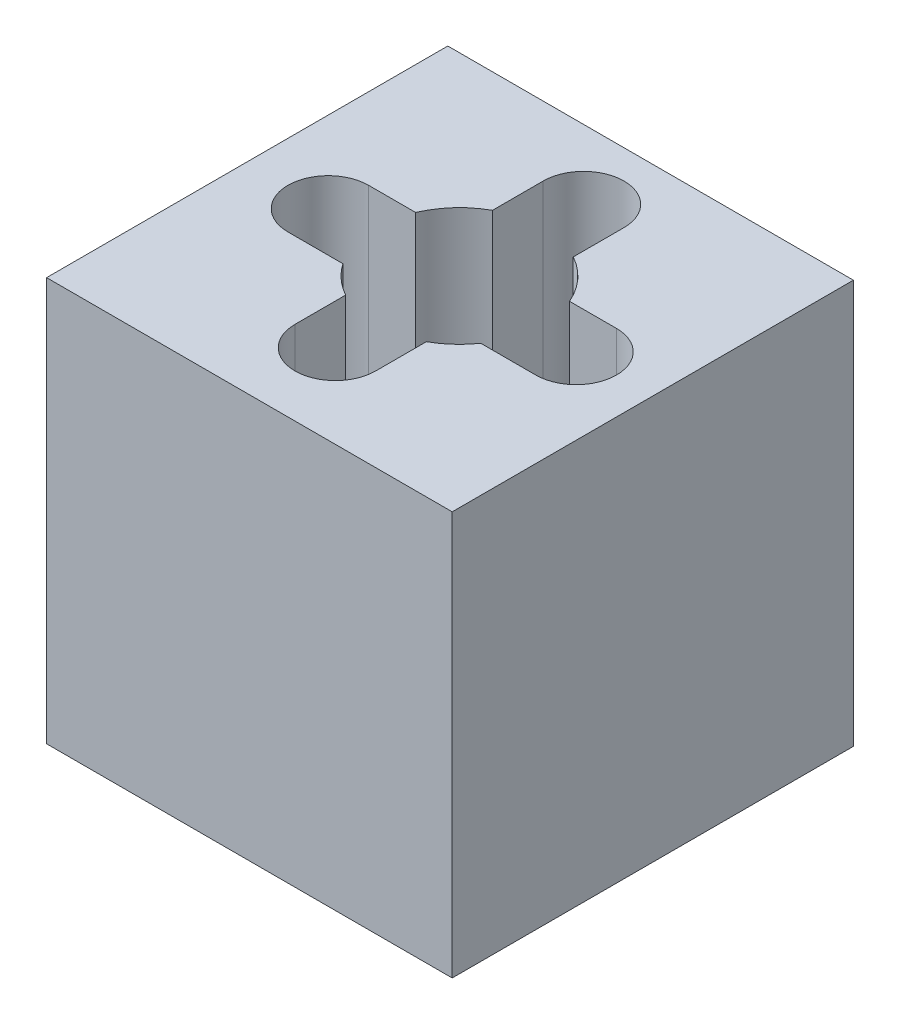
ISO-10303-21;
HEADER;
FILE_DESCRIPTION(('STEP AP214'),'2;1');
FILE_NAME('part.step','',(''),(''),'','','');
FILE_SCHEMA(('AUTOMOTIVE_DESIGN { 1 0 10303 214 1 1 1 1 }'));
ENDSEC;
DATA;
#1=APPLICATION_CONTEXT('core data for automotive mechanical design processes');
#2=APPLICATION_PROTOCOL_DEFINITION('international standard','automotive_design',2000,#1);
#3=PRODUCT_CONTEXT('',#1,'mechanical');
#4=PRODUCT('Part','Part','',(#3));
#5=PRODUCT_RELATED_PRODUCT_CATEGORY('part','',(#4));
#6=PRODUCT_DEFINITION_FORMATION('','',#4);
#7=PRODUCT_DEFINITION_CONTEXT('part definition',#1,'design');
#8=PRODUCT_DEFINITION('design','',#6,#7);
#9=PRODUCT_DEFINITION_SHAPE('','',#8);
#10=(LENGTH_UNIT() NAMED_UNIT(*) SI_UNIT(.MILLI.,.METRE.));
#11=(NAMED_UNIT(*) PLANE_ANGLE_UNIT() SI_UNIT($,.RADIAN.));
#12=(NAMED_UNIT(*) SI_UNIT($,.STERADIAN.) SOLID_ANGLE_UNIT());
#13=UNCERTAINTY_MEASURE_WITH_UNIT(LENGTH_MEASURE(1.E-05),#10,'distance_accuracy_value','');
#14=(GEOMETRIC_REPRESENTATION_CONTEXT(3) GLOBAL_UNCERTAINTY_ASSIGNED_CONTEXT((#13)) GLOBAL_UNIT_ASSIGNED_CONTEXT((#10,
#11,#12)) REPRESENTATION_CONTEXT('',''));
#15=CARTESIAN_POINT('',(0.,0.,0.));
#16=DIRECTION('',(0.,0.,1.));
#17=DIRECTION('',(1.,0.,0.));
#18=AXIS2_PLACEMENT_3D('',#15,#16,#17);
#19=CARTESIAN_POINT('',(2.52404638109781,5.08,0.));
#20=DIRECTION('',(1.,0.,0.));
#21=DIRECTION('',(0.,0.,-1.));
#22=AXIS2_PLACEMENT_3D('',#19,#20,#21);
#23=PLANE('',#22);
#24=DIRECTION('',(0.,0.,1.));
#25=VECTOR('',#24,1.);
#26=CARTESIAN_POINT('',(2.52404638109781,0.,0.));
#27=LINE('',#26,#25);
#28=CARTESIAN_POINT('',(2.52404638109781,0.,-2.43268730964854));
#29=VERTEX_POINT('',#28);
#30=CARTESIAN_POINT('',(2.52404638109781,0.,2.61535789353507));
#31=VERTEX_POINT('',#30);
#32=EDGE_CURVE('E326',#29,#31,#27,.T.);
#33=ORIENTED_EDGE('',*,*,#32,.F.);
#34=DIRECTION('',(0.,-1.,0.));
#35=VECTOR('',#34,1.);
#36=CARTESIAN_POINT('',(2.52404638109781,5.08,-2.43268730964854));
#37=LINE('',#36,#35);
#38=CARTESIAN_POINT('',(2.52404638109781,5.08,-2.43268730964854));
#39=VERTEX_POINT('',#38);
#40=EDGE_CURVE('E12',#39,#29,#37,.T.);
#41=ORIENTED_EDGE('',*,*,#40,.F.);
#42=DIRECTION('',(0.,0.,1.));
#43=VECTOR('',#42,1.);
#44=CARTESIAN_POINT('',(2.52404638109781,5.08,0.));
#45=LINE('',#44,#43);
#46=CARTESIAN_POINT('',(2.52404638109781,5.08,2.61535789353507));
#47=VERTEX_POINT('',#46);
#48=EDGE_CURVE('E354',#39,#47,#45,.T.);
#49=ORIENTED_EDGE('',*,*,#48,.T.);
#50=DIRECTION('',(0.,-1.,0.));
#51=VECTOR('',#50,1.);
#52=CARTESIAN_POINT('',(2.52404638109781,5.08,2.61535789353507));
#53=LINE('',#52,#51);
#54=EDGE_CURVE('E366',#47,#31,#53,.T.);
#55=ORIENTED_EDGE('',*,*,#54,.T.);
#56=EDGE_LOOP('',(#33,#41,#49,#55));
#57=FACE_BOUND('',#56,.T.);
#58=ADVANCED_FACE('F95',(#57),#23,.T.);
#59=CARTESIAN_POINT('',(0.,5.08,-2.43268730964854));
#60=DIRECTION('',(0.,0.,-1.));
#61=DIRECTION('',(-1.,0.,0.));
#62=AXIS2_PLACEMENT_3D('',#59,#60,#61);
#63=PLANE('',#62);
#64=DIRECTION('',(1.,0.,0.));
#65=VECTOR('',#64,1.);
#66=CARTESIAN_POINT('',(0.,0.,-2.43268730964854));
#67=LINE('',#66,#65);
#68=CARTESIAN_POINT('',(-2.57945038398401,0.,-2.43268730964854));
#69=VERTEX_POINT('',#68);
#70=EDGE_CURVE('E369',#69,#29,#67,.T.);
#71=ORIENTED_EDGE('',*,*,#70,.F.);
#72=DIRECTION('',(0.,-1.,0.));
#73=VECTOR('',#72,1.);
#74=CARTESIAN_POINT('',(-2.57945038398401,5.08,-2.43268730964854));
#75=LINE('',#74,#73);
#76=CARTESIAN_POINT('',(-2.57945038398401,5.08,-2.43268730964854));
#77=VERTEX_POINT('',#76);
#78=EDGE_CURVE('E102',#77,#69,#75,.T.);
#79=ORIENTED_EDGE('',*,*,#78,.F.);
#80=DIRECTION('',(1.,0.,0.));
#81=VECTOR('',#80,1.);
#82=CARTESIAN_POINT('',(0.,5.08,-2.43268730964854));
#83=LINE('',#82,#81);
#84=EDGE_CURVE('E357',#77,#39,#83,.T.);
#85=ORIENTED_EDGE('',*,*,#84,.T.);
#86=ORIENTED_EDGE('',*,*,#40,.T.);
#87=EDGE_LOOP('',(#71,#79,#85,#86));
#88=FACE_BOUND('',#87,.T.);
#89=ADVANCED_FACE('F386',(#88),#63,.T.);
#90=CARTESIAN_POINT('',(-2.57945038398401,5.08,0.));
#91=DIRECTION('',(-1.,0.,0.));
#92=DIRECTION('',(0.,0.,1.));
#93=AXIS2_PLACEMENT_3D('',#90,#91,#92);
#94=PLANE('',#93);
#95=DIRECTION('',(0.,0.,-1.));
#96=VECTOR('',#95,1.);
#97=CARTESIAN_POINT('',(-2.57945038398401,0.,0.));
#98=LINE('',#97,#96);
#99=CARTESIAN_POINT('',(-2.57945038398401,0.,2.61535789353507));
#100=VERTEX_POINT('',#99);
#101=EDGE_CURVE('E372',#100,#69,#98,.T.);
#102=ORIENTED_EDGE('',*,*,#101,.F.);
#103=DIRECTION('',(0.,-1.,0.));
#104=VECTOR('',#103,1.);
#105=CARTESIAN_POINT('',(-2.57945038398401,5.08,2.61535789353507));
#106=LINE('',#105,#104);
#107=CARTESIAN_POINT('',(-2.57945038398401,5.08,2.61535789353507));
#108=VERTEX_POINT('',#107);
#109=EDGE_CURVE('E378',#108,#100,#106,.T.);
#110=ORIENTED_EDGE('',*,*,#109,.F.);
#111=DIRECTION('',(0.,0.,-1.));
#112=VECTOR('',#111,1.);
#113=CARTESIAN_POINT('',(-2.57945038398401,5.08,0.));
#114=LINE('',#113,#112);
#115=EDGE_CURVE('E361',#108,#77,#114,.T.);
#116=ORIENTED_EDGE('',*,*,#115,.T.);
#117=ORIENTED_EDGE('',*,*,#78,.T.);
#118=EDGE_LOOP('',(#102,#110,#116,#117));
#119=FACE_BOUND('',#118,.T.);
#120=ADVANCED_FACE('F382',(#119),#94,.T.);
#121=CARTESIAN_POINT('',(0.,5.08,2.61535789353507));
#122=DIRECTION('',(0.,0.,-1.));
#123=DIRECTION('',(-1.,0.,0.));
#124=AXIS2_PLACEMENT_3D('',#121,#122,#123);
#125=PLANE('',#124);
#126=DIRECTION('',(1.,0.,0.));
#127=VECTOR('',#126,1.);
#128=CARTESIAN_POINT('',(0.,0.,2.61535789353507));
#129=LINE('',#128,#127);
#130=EDGE_CURVE('E358',#100,#31,#129,.T.);
#131=ORIENTED_EDGE('',*,*,#130,.T.);
#132=ORIENTED_EDGE('',*,*,#54,.F.);
#133=DIRECTION('',(1.,0.,0.));
#134=VECTOR('',#133,1.);
#135=CARTESIAN_POINT('',(0.,5.08,2.61535789353507));
#136=LINE('',#135,#134);
#137=EDGE_CURVE('E364',#108,#47,#136,.T.);
#138=ORIENTED_EDGE('',*,*,#137,.F.);
#139=ORIENTED_EDGE('',*,*,#109,.T.);
#140=EDGE_LOOP('',(#131,#132,#138,#139));
#141=FACE_BOUND('',#140,.T.);
#142=ADVANCED_FACE('F393',(#141),#125,.F.);
#143=CARTESIAN_POINT('',(0.,5.08,0.));
#144=DIRECTION('',(0.,1.,0.));
#145=DIRECTION('',(0.,0.,1.));
#146=AXIS2_PLACEMENT_3D('',#143,#144,#145);
#147=PLANE('',#146);
#148=CARTESIAN_POINT('',(-1.55942754703309,5.08,0.0913352919432654));
#149=DIRECTION('',(0.,-1.,0.));
#150=DIRECTION('',(0.,0.,-1.));
#151=AXIS2_PLACEMENT_3D('',#148,#149,#150);
#152=CIRCLE('',#151,0.508);
#153=CARTESIAN_POINT('',(-1.55942754703309,5.08,0.599335291943265));
#154=VERTEX_POINT('',#153);
#155=CARTESIAN_POINT('',(-1.55942754703309,5.08,-0.416664708056734));
#156=VERTEX_POINT('',#155);
#157=EDGE_CURVE('E232',#154,#156,#152,.T.);
#158=ORIENTED_EDGE('',*,*,#157,.T.);
#159=DIRECTION('',(1.,0.,0.));
#160=VECTOR('',#159,1.);
#161=CARTESIAN_POINT('',(-1.55942754703309,5.08,-0.416664708056734));
#162=LINE('',#161,#160);
#163=CARTESIAN_POINT('',(-0.968254786231391,5.08,-0.416664708056734));
#164=VERTEX_POINT('',#163);
#165=EDGE_CURVE('E238',#156,#164,#162,.T.);
#166=ORIENTED_EDGE('',*,*,#165,.T.);
#167=CARTESIAN_POINT('',(0.,5.08,0.));
#168=DIRECTION('',(0.,1.,0.));
#169=DIRECTION('',(0.,0.,1.));
#170=AXIS2_PLACEMENT_3D('',#167,#168,#169);
#171=CIRCLE('',#170,1.0541);
#172=CARTESIAN_POINT('',(-0.508,5.08,-0.923613994047297));
#173=VERTEX_POINT('',#172);
#174=EDGE_CURVE('E242',#173,#164,#171,.T.);
#175=ORIENTED_EDGE('',*,*,#174,.F.);
#176=DIRECTION('',(0.,0.,1.));
#177=VECTOR('',#176,1.);
#178=CARTESIAN_POINT('',(-0.508,5.08,-1.5621));
#179=LINE('',#178,#177);
#180=CARTESIAN_POINT('',(-0.508,5.08,-1.5621));
#181=VERTEX_POINT('',#180);
#182=EDGE_CURVE('E254',#181,#173,#179,.T.);
#183=ORIENTED_EDGE('',*,*,#182,.F.);
#184=CARTESIAN_POINT('',(0.,5.08,-1.5621));
#185=DIRECTION('',(0.,1.,0.));
#186=DIRECTION('',(0.,0.,1.));
#187=AXIS2_PLACEMENT_3D('',#184,#185,#186);
#188=CIRCLE('',#187,0.508);
#189=CARTESIAN_POINT('',(0.508,5.08,-1.5621));
#190=VERTEX_POINT('',#189);
#191=EDGE_CURVE('E256',#190,#181,#188,.T.);
#192=ORIENTED_EDGE('',*,*,#191,.F.);
#193=DIRECTION('',(0.,0.,1.));
#194=VECTOR('',#193,1.);
#195=CARTESIAN_POINT('',(0.508,5.08,-1.5621));
#196=LINE('',#195,#194);
#197=CARTESIAN_POINT('',(0.508,5.08,-0.923613994047297));
#198=VERTEX_POINT('',#197);
#199=EDGE_CURVE('E258',#190,#198,#196,.T.);
#200=ORIENTED_EDGE('',*,*,#199,.T.);
#201=CARTESIAN_POINT('',(0.,5.08,0.));
#202=DIRECTION('',(0.,1.,0.));
#203=DIRECTION('',(0.,0.,1.));
#204=AXIS2_PLACEMENT_3D('',#201,#202,#203);
#205=CIRCLE('',#204,1.0541);
#206=CARTESIAN_POINT('',(0.968254786231391,5.08,-0.416664708056734));
#207=VERTEX_POINT('',#206);
#208=EDGE_CURVE('E261',#207,#198,#205,.T.);
#209=ORIENTED_EDGE('',*,*,#208,.F.);
#210=DIRECTION('',(-1.,0.,0.));
#211=VECTOR('',#210,1.);
#212=CARTESIAN_POINT('',(1.55942754703309,5.08,-0.416664708056735));
#213=LINE('',#212,#211);
#214=CARTESIAN_POINT('',(1.55942754703309,5.08,-0.416664708056735));
#215=VERTEX_POINT('',#214);
#216=EDGE_CURVE('E263',#215,#207,#213,.T.);
#217=ORIENTED_EDGE('',*,*,#216,.F.);
#218=CARTESIAN_POINT('',(1.55942754703309,5.08,0.091335291943265));
#219=DIRECTION('',(0.,1.,0.));
#220=DIRECTION('',(0.,0.,1.));
#221=AXIS2_PLACEMENT_3D('',#218,#219,#220);
#222=CIRCLE('',#221,0.508);
#223=CARTESIAN_POINT('',(1.55942754703309,5.08,0.599335291943265));
#224=VERTEX_POINT('',#223);
#225=EDGE_CURVE('E265',#224,#215,#222,.T.);
#226=ORIENTED_EDGE('',*,*,#225,.F.);
#227=DIRECTION('',(-1.,0.,0.));
#228=VECTOR('',#227,1.);
#229=CARTESIAN_POINT('',(1.55942754703309,5.08,0.599335291943265));
#230=LINE('',#229,#228);
#231=CARTESIAN_POINT('',(0.86713552448927,5.08,0.599335291943265));
#232=VERTEX_POINT('',#231);
#233=EDGE_CURVE('E267',#224,#232,#230,.T.);
#234=ORIENTED_EDGE('',*,*,#233,.T.);
#235=CARTESIAN_POINT('',(0.,5.08,0.));
#236=DIRECTION('',(0.,1.,0.));
#237=DIRECTION('',(0.,0.,1.));
#238=AXIS2_PLACEMENT_3D('',#235,#236,#237);
#239=CIRCLE('',#238,1.0541);
#240=CARTESIAN_POINT('',(0.508,5.08,0.923613994047297));
#241=VERTEX_POINT('',#240);
#242=EDGE_CURVE('E270',#241,#232,#239,.T.);
#243=ORIENTED_EDGE('',*,*,#242,.F.);
#244=DIRECTION('',(0.,0.,-1.));
#245=VECTOR('',#244,1.);
#246=CARTESIAN_POINT('',(0.508,5.08,1.5621));
#247=LINE('',#246,#245);
#248=CARTESIAN_POINT('',(0.508,5.08,1.5621));
#249=VERTEX_POINT('',#248);
#250=EDGE_CURVE('E272',#249,#241,#247,.T.);
#251=ORIENTED_EDGE('',*,*,#250,.F.);
#252=CARTESIAN_POINT('',(0.,5.08,1.5621));
#253=DIRECTION('',(0.,-1.,0.));
#254=DIRECTION('',(0.,0.,-1.));
#255=AXIS2_PLACEMENT_3D('',#252,#253,#254);
#256=CIRCLE('',#255,0.508);
#257=CARTESIAN_POINT('',(-0.508,5.08,1.5621));
#258=VERTEX_POINT('',#257);
#259=EDGE_CURVE('E274',#249,#258,#256,.T.);
#260=ORIENTED_EDGE('',*,*,#259,.T.);
#261=DIRECTION('',(0.,0.,-1.));
#262=VECTOR('',#261,1.);
#263=CARTESIAN_POINT('',(-0.508,5.08,1.5621));
#264=LINE('',#263,#262);
#265=CARTESIAN_POINT('',(-0.508,5.08,0.923613994047297));
#266=VERTEX_POINT('',#265);
#267=EDGE_CURVE('E277',#258,#266,#264,.T.);
#268=ORIENTED_EDGE('',*,*,#267,.T.);
#269=CARTESIAN_POINT('',(0.,5.08,0.));
#270=DIRECTION('',(0.,1.,0.));
#271=DIRECTION('',(0.,0.,1.));
#272=AXIS2_PLACEMENT_3D('',#269,#270,#271);
#273=CIRCLE('',#272,1.0541);
#274=CARTESIAN_POINT('',(-0.86713552448927,5.08,0.599335291943265));
#275=VERTEX_POINT('',#274);
#276=EDGE_CURVE('E280',#275,#266,#273,.T.);
#277=ORIENTED_EDGE('',*,*,#276,.F.);
#278=DIRECTION('',(1.,0.,0.));
#279=VECTOR('',#278,1.);
#280=CARTESIAN_POINT('',(-1.55942754703309,5.08,0.599335291943265));
#281=LINE('',#280,#279);
#282=EDGE_CURVE('E235',#154,#275,#281,.T.);
#283=ORIENTED_EDGE('',*,*,#282,.F.);
#284=EDGE_LOOP('',(#158,#166,#175,#183,#192,#200,#209,#217,#226,#234,#243,#251,#260,#268,#277,#283));
#285=FACE_BOUND('',#284,.T.);
#286=ORIENTED_EDGE('',*,*,#48,.F.);
#287=ORIENTED_EDGE('',*,*,#84,.F.);
#288=ORIENTED_EDGE('',*,*,#115,.F.);
#289=ORIENTED_EDGE('',*,*,#137,.T.);
#290=EDGE_LOOP('',(#286,#287,#288,#289));
#291=FACE_BOUND('',#290,.T.);
#292=ADVANCED_FACE('F244',(#285,#291),#147,.T.);
#293=CARTESIAN_POINT('',(0.,0.,0.));
#294=DIRECTION('',(0.,1.,0.));
#295=DIRECTION('',(0.,0.,1.));
#296=AXIS2_PLACEMENT_3D('',#293,#294,#295);
#297=PLANE('',#296);
#298=DIRECTION('',(1.,0.,0.));
#299=VECTOR('',#298,1.);
#300=CARTESIAN_POINT('',(-1.55942754703309,0.,-0.416664708056734));
#301=LINE('',#300,#299);
#302=CARTESIAN_POINT('',(-1.55942754703309,0.,-0.416664708056734));
#303=VERTEX_POINT('',#302);
#304=CARTESIAN_POINT('',(-0.968254786231391,0.,-0.416664708056735));
#305=VERTEX_POINT('',#304);
#306=EDGE_CURVE('E284',#303,#305,#301,.T.);
#307=ORIENTED_EDGE('',*,*,#306,.F.);
#308=CARTESIAN_POINT('',(-1.55942754703309,0.,0.0913352919432654));
#309=DIRECTION('',(0.,-1.,0.));
#310=DIRECTION('',(0.,0.,-1.));
#311=AXIS2_PLACEMENT_3D('',#308,#309,#310);
#312=CIRCLE('',#311,0.508);
#313=CARTESIAN_POINT('',(-1.55942754703309,0.,0.599335291943265));
#314=VERTEX_POINT('',#313);
#315=EDGE_CURVE('E117',#314,#303,#312,.T.);
#316=ORIENTED_EDGE('',*,*,#315,.F.);
#317=DIRECTION('',(1.,0.,0.));
#318=VECTOR('',#317,1.);
#319=CARTESIAN_POINT('',(-1.55942754703309,0.,0.599335291943265));
#320=LINE('',#319,#318);
#321=CARTESIAN_POINT('',(-0.86713552448927,0.,0.599335291943265));
#322=VERTEX_POINT('',#321);
#323=EDGE_CURVE('E247',#314,#322,#320,.T.);
#324=ORIENTED_EDGE('',*,*,#323,.T.);
#325=CARTESIAN_POINT('',(0.,0.,0.));
#326=DIRECTION('',(0.,1.,0.));
#327=DIRECTION('',(0.,0.,1.));
#328=AXIS2_PLACEMENT_3D('',#325,#326,#327);
#329=CIRCLE('',#328,1.0541);
#330=CARTESIAN_POINT('',(-0.508,0.,0.923613994047297));
#331=VERTEX_POINT('',#330);
#332=EDGE_CURVE('E250',#322,#331,#329,.T.);
#333=ORIENTED_EDGE('',*,*,#332,.T.);
#334=DIRECTION('',(0.,0.,-1.));
#335=VECTOR('',#334,1.);
#336=CARTESIAN_POINT('',(-0.508,0.,1.5621));
#337=LINE('',#336,#335);
#338=CARTESIAN_POINT('',(-0.508,0.,1.5621));
#339=VERTEX_POINT('',#338);
#340=EDGE_CURVE('E319',#339,#331,#337,.T.);
#341=ORIENTED_EDGE('',*,*,#340,.F.);
#342=CARTESIAN_POINT('',(0.,0.,1.5621));
#343=DIRECTION('',(0.,-1.,0.));
#344=DIRECTION('',(0.,0.,-1.));
#345=AXIS2_PLACEMENT_3D('',#342,#343,#344);
#346=CIRCLE('',#345,0.508);
#347=CARTESIAN_POINT('',(0.508,0.,1.5621));
#348=VERTEX_POINT('',#347);
#349=EDGE_CURVE('E316',#348,#339,#346,.T.);
#350=ORIENTED_EDGE('',*,*,#349,.F.);
#351=DIRECTION('',(0.,0.,-1.));
#352=VECTOR('',#351,1.);
#353=CARTESIAN_POINT('',(0.508,0.,1.5621));
#354=LINE('',#353,#352);
#355=CARTESIAN_POINT('',(0.508,0.,0.923613994047297));
#356=VERTEX_POINT('',#355);
#357=EDGE_CURVE('E313',#348,#356,#354,.T.);
#358=ORIENTED_EDGE('',*,*,#357,.T.);
#359=CARTESIAN_POINT('',(0.,0.,0.));
#360=DIRECTION('',(0.,1.,0.));
#361=DIRECTION('',(0.,0.,1.));
#362=AXIS2_PLACEMENT_3D('',#359,#360,#361);
#363=CIRCLE('',#362,1.0541);
#364=CARTESIAN_POINT('',(0.86713552448927,0.,0.599335291943265));
#365=VERTEX_POINT('',#364);
#366=EDGE_CURVE('E310',#356,#365,#363,.T.);
#367=ORIENTED_EDGE('',*,*,#366,.T.);
#368=DIRECTION('',(-1.,0.,0.));
#369=VECTOR('',#368,1.);
#370=CARTESIAN_POINT('',(1.55942754703309,0.,0.599335291943265));
#371=LINE('',#370,#369);
#372=CARTESIAN_POINT('',(1.55942754703309,0.,0.599335291943265));
#373=VERTEX_POINT('',#372);
#374=EDGE_CURVE('E307',#373,#365,#371,.T.);
#375=ORIENTED_EDGE('',*,*,#374,.F.);
#376=CARTESIAN_POINT('',(1.55942754703309,0.,0.091335291943265));
#377=DIRECTION('',(0.,1.,0.));
#378=DIRECTION('',(0.,0.,1.));
#379=AXIS2_PLACEMENT_3D('',#376,#377,#378);
#380=CIRCLE('',#379,0.508);
#381=CARTESIAN_POINT('',(1.55942754703309,0.,-0.416664708056735));
#382=VERTEX_POINT('',#381);
#383=EDGE_CURVE('E304',#373,#382,#380,.T.);
#384=ORIENTED_EDGE('',*,*,#383,.T.);
#385=DIRECTION('',(-1.,0.,0.));
#386=VECTOR('',#385,1.);
#387=CARTESIAN_POINT('',(1.55942754703309,0.,-0.416664708056735));
#388=LINE('',#387,#386);
#389=CARTESIAN_POINT('',(0.968254786231391,0.,-0.416664708056734));
#390=VERTEX_POINT('',#389);
#391=EDGE_CURVE('E301',#382,#390,#388,.T.);
#392=ORIENTED_EDGE('',*,*,#391,.T.);
#393=CARTESIAN_POINT('',(0.,0.,0.));
#394=DIRECTION('',(0.,1.,0.));
#395=DIRECTION('',(0.,0.,1.));
#396=AXIS2_PLACEMENT_3D('',#393,#394,#395);
#397=CIRCLE('',#396,1.0541);
#398=CARTESIAN_POINT('',(0.508,0.,-0.923613994047297));
#399=VERTEX_POINT('',#398);
#400=EDGE_CURVE('E298',#390,#399,#397,.T.);
#401=ORIENTED_EDGE('',*,*,#400,.T.);
#402=DIRECTION('',(0.,0.,1.));
#403=VECTOR('',#402,1.);
#404=CARTESIAN_POINT('',(0.508,0.,-1.5621));
#405=LINE('',#404,#403);
#406=CARTESIAN_POINT('',(0.508,0.,-1.5621));
#407=VERTEX_POINT('',#406);
#408=EDGE_CURVE('E295',#407,#399,#405,.T.);
#409=ORIENTED_EDGE('',*,*,#408,.F.);
#410=CARTESIAN_POINT('',(0.,0.,-1.5621));
#411=DIRECTION('',(0.,1.,0.));
#412=DIRECTION('',(0.,0.,1.));
#413=AXIS2_PLACEMENT_3D('',#410,#411,#412);
#414=CIRCLE('',#413,0.508);
#415=CARTESIAN_POINT('',(-0.508,0.,-1.5621));
#416=VERTEX_POINT('',#415);
#417=EDGE_CURVE('E292',#407,#416,#414,.T.);
#418=ORIENTED_EDGE('',*,*,#417,.T.);
#419=DIRECTION('',(0.,0.,1.));
#420=VECTOR('',#419,1.);
#421=CARTESIAN_POINT('',(-0.508,0.,-1.5621));
#422=LINE('',#421,#420);
#423=CARTESIAN_POINT('',(-0.508,0.,-0.923613994047297));
#424=VERTEX_POINT('',#423);
#425=EDGE_CURVE('E289',#416,#424,#422,.T.);
#426=ORIENTED_EDGE('',*,*,#425,.T.);
#427=CARTESIAN_POINT('',(0.,0.,0.));
#428=DIRECTION('',(0.,1.,0.));
#429=DIRECTION('',(0.,0.,1.));
#430=AXIS2_PLACEMENT_3D('',#427,#428,#429);
#431=CIRCLE('',#430,1.0541);
#432=EDGE_CURVE('E286',#424,#305,#431,.T.);
#433=ORIENTED_EDGE('',*,*,#432,.T.);
#434=EDGE_LOOP('',(#307,#316,#324,#333,#341,#350,#358,#367,#375,#384,#392,#401,#409,#418,#426,#433));
#435=FACE_BOUND('',#434,.T.);
#436=ORIENTED_EDGE('',*,*,#32,.T.);
#437=ORIENTED_EDGE('',*,*,#130,.F.);
#438=ORIENTED_EDGE('',*,*,#101,.T.);
#439=ORIENTED_EDGE('',*,*,#70,.T.);
#440=EDGE_LOOP('',(#436,#437,#438,#439));
#441=FACE_BOUND('',#440,.T.);
#442=ADVANCED_FACE('F390',(#435,#441),#297,.F.);
#443=CARTESIAN_POINT('',(-1.55942754703309,5.08,0.0913352919432654));
#444=DIRECTION('',(0.,-1.,0.));
#445=DIRECTION('',(0.,0.,-1.));
#446=AXIS2_PLACEMENT_3D('',#443,#444,#445);
#447=CYLINDRICAL_SURFACE('',#446,0.508);
#448=ORIENTED_EDGE('',*,*,#315,.T.);
#449=DIRECTION('',(0.,-1.,0.));
#450=VECTOR('',#449,1.);
#451=CARTESIAN_POINT('',(-1.55942754703309,5.08,-0.416664708056734));
#452=LINE('',#451,#450);
#453=EDGE_CURVE('E229',#156,#303,#452,.T.);
#454=ORIENTED_EDGE('',*,*,#453,.F.);
#455=ORIENTED_EDGE('',*,*,#157,.F.);
#456=DIRECTION('',(0.,-1.,0.));
#457=VECTOR('',#456,1.);
#458=CARTESIAN_POINT('',(-1.55942754703309,5.08,0.599335291943265));
#459=LINE('',#458,#457);
#460=EDGE_CURVE('E324',#154,#314,#459,.T.);
#461=ORIENTED_EDGE('',*,*,#460,.T.);
#462=EDGE_LOOP('',(#448,#454,#455,#461));
#463=FACE_BOUND('',#462,.T.);
#464=ADVANCED_FACE('F230',(#463),#447,.F.);
#465=CARTESIAN_POINT('',(-1.55942754703309,5.08,0.599335291943265));
#466=DIRECTION('',(0.,0.,-1.));
#467=DIRECTION('',(-1.,0.,0.));
#468=AXIS2_PLACEMENT_3D('',#465,#466,#467);
#469=PLANE('',#468);
#470=ORIENTED_EDGE('',*,*,#323,.F.);
#471=ORIENTED_EDGE('',*,*,#460,.F.);
#472=ORIENTED_EDGE('',*,*,#282,.T.);
#473=DIRECTION('',(0.,-1.,0.));
#474=VECTOR('',#473,1.);
#475=CARTESIAN_POINT('',(-0.86713552448927,5.08,0.599335291943265));
#476=LINE('',#475,#474);
#477=EDGE_CURVE('E327',#275,#322,#476,.T.);
#478=ORIENTED_EDGE('',*,*,#477,.T.);
#479=EDGE_LOOP('',(#470,#471,#472,#478));
#480=FACE_BOUND('',#479,.T.);
#481=ADVANCED_FACE('F415',(#480),#469,.T.);
#482=CARTESIAN_POINT('',(0.,5.08,0.));
#483=DIRECTION('',(0.,-1.,0.));
#484=DIRECTION('',(0.,0.,-1.));
#485=AXIS2_PLACEMENT_3D('',#482,#483,#484);
#486=CYLINDRICAL_SURFACE('',#485,1.0541);
#487=ORIENTED_EDGE('',*,*,#332,.F.);
#488=ORIENTED_EDGE('',*,*,#477,.F.);
#489=ORIENTED_EDGE('',*,*,#276,.T.);
#490=DIRECTION('',(0.,-1.,0.));
#491=VECTOR('',#490,1.);
#492=CARTESIAN_POINT('',(-0.508,5.08,0.923613994047297));
#493=LINE('',#492,#491);
#494=EDGE_CURVE('E329',#266,#331,#493,.T.);
#495=ORIENTED_EDGE('',*,*,#494,.T.);
#496=EDGE_LOOP('',(#487,#488,#489,#495));
#497=FACE_BOUND('',#496,.T.);
#498=ADVANCED_FACE('F465',(#497),#486,.F.);
#499=CARTESIAN_POINT('',(-0.508,5.08,1.5621));
#500=DIRECTION('',(-1.,0.,0.));
#501=DIRECTION('',(0.,0.,1.));
#502=AXIS2_PLACEMENT_3D('',#499,#500,#501);
#503=PLANE('',#502);
#504=ORIENTED_EDGE('',*,*,#340,.T.);
#505=ORIENTED_EDGE('',*,*,#494,.F.);
#506=ORIENTED_EDGE('',*,*,#267,.F.);
#507=DIRECTION('',(0.,-1.,0.));
#508=VECTOR('',#507,1.);
#509=CARTESIAN_POINT('',(-0.508,5.08,1.5621));
#510=LINE('',#509,#508);
#511=EDGE_CURVE('E331',#258,#339,#510,.T.);
#512=ORIENTED_EDGE('',*,*,#511,.T.);
#513=EDGE_LOOP('',(#504,#505,#506,#512));
#514=FACE_BOUND('',#513,.T.);
#515=ADVANCED_FACE('F461',(#514),#503,.F.);
#516=CARTESIAN_POINT('',(0.,5.08,1.5621));
#517=DIRECTION('',(0.,-1.,0.));
#518=DIRECTION('',(0.,0.,-1.));
#519=AXIS2_PLACEMENT_3D('',#516,#517,#518);
#520=CYLINDRICAL_SURFACE('',#519,0.508);
#521=ORIENTED_EDGE('',*,*,#349,.T.);
#522=ORIENTED_EDGE('',*,*,#511,.F.);
#523=ORIENTED_EDGE('',*,*,#259,.F.);
#524=DIRECTION('',(0.,-1.,0.));
#525=VECTOR('',#524,1.);
#526=CARTESIAN_POINT('',(0.508,5.08,1.5621));
#527=LINE('',#526,#525);
#528=EDGE_CURVE('E333',#249,#348,#527,.T.);
#529=ORIENTED_EDGE('',*,*,#528,.T.);
#530=EDGE_LOOP('',(#521,#522,#523,#529));
#531=FACE_BOUND('',#530,.T.);
#532=ADVANCED_FACE('F457',(#531),#520,.F.);
#533=CARTESIAN_POINT('',(0.508,5.08,1.5621));
#534=DIRECTION('',(-1.,0.,0.));
#535=DIRECTION('',(0.,0.,1.));
#536=AXIS2_PLACEMENT_3D('',#533,#534,#535);
#537=PLANE('',#536);
#538=ORIENTED_EDGE('',*,*,#357,.F.);
#539=ORIENTED_EDGE('',*,*,#528,.F.);
#540=ORIENTED_EDGE('',*,*,#250,.T.);
#541=DIRECTION('',(0.,-1.,0.));
#542=VECTOR('',#541,1.);
#543=CARTESIAN_POINT('',(0.508,5.08,0.923613994047297));
#544=LINE('',#543,#542);
#545=EDGE_CURVE('E335',#241,#356,#544,.T.);
#546=ORIENTED_EDGE('',*,*,#545,.T.);
#547=EDGE_LOOP('',(#538,#539,#540,#546));
#548=FACE_BOUND('',#547,.T.);
#549=ADVANCED_FACE('F453',(#548),#537,.T.);
#550=CARTESIAN_POINT('',(0.,5.08,0.));
#551=DIRECTION('',(0.,-1.,0.));
#552=DIRECTION('',(0.,0.,-1.));
#553=AXIS2_PLACEMENT_3D('',#550,#551,#552);
#554=CYLINDRICAL_SURFACE('',#553,1.0541);
#555=ORIENTED_EDGE('',*,*,#366,.F.);
#556=ORIENTED_EDGE('',*,*,#545,.F.);
#557=ORIENTED_EDGE('',*,*,#242,.T.);
#558=DIRECTION('',(0.,-1.,0.));
#559=VECTOR('',#558,1.);
#560=CARTESIAN_POINT('',(0.86713552448927,5.08,0.599335291943265));
#561=LINE('',#560,#559);
#562=EDGE_CURVE('E337',#232,#365,#561,.T.);
#563=ORIENTED_EDGE('',*,*,#562,.T.);
#564=EDGE_LOOP('',(#555,#556,#557,#563));
#565=FACE_BOUND('',#564,.T.);
#566=ADVANCED_FACE('F449',(#565),#554,.F.);
#567=CARTESIAN_POINT('',(1.55942754703309,5.08,0.599335291943265));
#568=DIRECTION('',(0.,0.,1.));
#569=DIRECTION('',(1.,0.,0.));
#570=AXIS2_PLACEMENT_3D('',#567,#568,#569);
#571=PLANE('',#570);
#572=ORIENTED_EDGE('',*,*,#374,.T.);
#573=ORIENTED_EDGE('',*,*,#562,.F.);
#574=ORIENTED_EDGE('',*,*,#233,.F.);
#575=DIRECTION('',(0.,-1.,0.));
#576=VECTOR('',#575,1.);
#577=CARTESIAN_POINT('',(1.55942754703309,5.08,0.599335291943265));
#578=LINE('',#577,#576);
#579=EDGE_CURVE('E339',#224,#373,#578,.T.);
#580=ORIENTED_EDGE('',*,*,#579,.T.);
#581=EDGE_LOOP('',(#572,#573,#574,#580));
#582=FACE_BOUND('',#581,.T.);
#583=ADVANCED_FACE('F445',(#582),#571,.F.);
#584=CARTESIAN_POINT('',(1.55942754703309,5.08,0.091335291943265));
#585=DIRECTION('',(0.,-1.,0.));
#586=DIRECTION('',(0.,0.,-1.));
#587=AXIS2_PLACEMENT_3D('',#584,#585,#586);
#588=CYLINDRICAL_SURFACE('',#587,0.508);
#589=ORIENTED_EDGE('',*,*,#383,.F.);
#590=ORIENTED_EDGE('',*,*,#579,.F.);
#591=ORIENTED_EDGE('',*,*,#225,.T.);
#592=DIRECTION('',(0.,-1.,0.));
#593=VECTOR('',#592,1.);
#594=CARTESIAN_POINT('',(1.55942754703309,5.08,-0.416664708056735));
#595=LINE('',#594,#593);
#596=EDGE_CURVE('E341',#215,#382,#595,.T.);
#597=ORIENTED_EDGE('',*,*,#596,.T.);
#598=EDGE_LOOP('',(#589,#590,#591,#597));
#599=FACE_BOUND('',#598,.T.);
#600=ADVANCED_FACE('F441',(#599),#588,.F.);
#601=CARTESIAN_POINT('',(1.55942754703309,5.08,-0.416664708056735));
#602=DIRECTION('',(0.,0.,1.));
#603=DIRECTION('',(1.,0.,0.));
#604=AXIS2_PLACEMENT_3D('',#601,#602,#603);
#605=PLANE('',#604);
#606=ORIENTED_EDGE('',*,*,#391,.F.);
#607=ORIENTED_EDGE('',*,*,#596,.F.);
#608=ORIENTED_EDGE('',*,*,#216,.T.);
#609=DIRECTION('',(0.,-1.,0.));
#610=VECTOR('',#609,1.);
#611=CARTESIAN_POINT('',(0.968254786231391,5.08,-0.416664708056734));
#612=LINE('',#611,#610);
#613=EDGE_CURVE('E343',#207,#390,#612,.T.);
#614=ORIENTED_EDGE('',*,*,#613,.T.);
#615=EDGE_LOOP('',(#606,#607,#608,#614));
#616=FACE_BOUND('',#615,.T.);
#617=ADVANCED_FACE('F437',(#616),#605,.T.);
#618=CARTESIAN_POINT('',(0.,5.08,0.));
#619=DIRECTION('',(0.,-1.,0.));
#620=DIRECTION('',(0.,0.,-1.));
#621=AXIS2_PLACEMENT_3D('',#618,#619,#620);
#622=CYLINDRICAL_SURFACE('',#621,1.0541);
#623=ORIENTED_EDGE('',*,*,#400,.F.);
#624=ORIENTED_EDGE('',*,*,#613,.F.);
#625=ORIENTED_EDGE('',*,*,#208,.T.);
#626=DIRECTION('',(0.,-1.,0.));
#627=VECTOR('',#626,1.);
#628=CARTESIAN_POINT('',(0.508,5.08,-0.923613994047297));
#629=LINE('',#628,#627);
#630=EDGE_CURVE('E345',#198,#399,#629,.T.);
#631=ORIENTED_EDGE('',*,*,#630,.T.);
#632=EDGE_LOOP('',(#623,#624,#625,#631));
#633=FACE_BOUND('',#632,.T.);
#634=ADVANCED_FACE('F433',(#633),#622,.F.);
#635=CARTESIAN_POINT('',(0.508,5.08,-1.5621));
#636=DIRECTION('',(1.,0.,0.));
#637=DIRECTION('',(0.,0.,-1.));
#638=AXIS2_PLACEMENT_3D('',#635,#636,#637);
#639=PLANE('',#638);
#640=ORIENTED_EDGE('',*,*,#408,.T.);
#641=ORIENTED_EDGE('',*,*,#630,.F.);
#642=ORIENTED_EDGE('',*,*,#199,.F.);
#643=DIRECTION('',(0.,-1.,0.));
#644=VECTOR('',#643,1.);
#645=CARTESIAN_POINT('',(0.508,5.08,-1.5621));
#646=LINE('',#645,#644);
#647=EDGE_CURVE('E347',#190,#407,#646,.T.);
#648=ORIENTED_EDGE('',*,*,#647,.T.);
#649=EDGE_LOOP('',(#640,#641,#642,#648));
#650=FACE_BOUND('',#649,.T.);
#651=ADVANCED_FACE('F429',(#650),#639,.F.);
#652=CARTESIAN_POINT('',(0.,5.08,-1.5621));
#653=DIRECTION('',(0.,-1.,0.));
#654=DIRECTION('',(0.,0.,-1.));
#655=AXIS2_PLACEMENT_3D('',#652,#653,#654);
#656=CYLINDRICAL_SURFACE('',#655,0.508);
#657=ORIENTED_EDGE('',*,*,#417,.F.);
#658=ORIENTED_EDGE('',*,*,#647,.F.);
#659=ORIENTED_EDGE('',*,*,#191,.T.);
#660=DIRECTION('',(0.,-1.,0.));
#661=VECTOR('',#660,1.);
#662=CARTESIAN_POINT('',(-0.508,5.08,-1.5621));
#663=LINE('',#662,#661);
#664=EDGE_CURVE('E349',#181,#416,#663,.T.);
#665=ORIENTED_EDGE('',*,*,#664,.T.);
#666=EDGE_LOOP('',(#657,#658,#659,#665));
#667=FACE_BOUND('',#666,.T.);
#668=ADVANCED_FACE('F425',(#667),#656,.F.);
#669=CARTESIAN_POINT('',(-0.508,5.08,-1.5621));
#670=DIRECTION('',(1.,0.,0.));
#671=DIRECTION('',(0.,0.,-1.));
#672=AXIS2_PLACEMENT_3D('',#669,#670,#671);
#673=PLANE('',#672);
#674=ORIENTED_EDGE('',*,*,#425,.F.);
#675=ORIENTED_EDGE('',*,*,#664,.F.);
#676=ORIENTED_EDGE('',*,*,#182,.T.);
#677=DIRECTION('',(0.,-1.,0.));
#678=VECTOR('',#677,1.);
#679=CARTESIAN_POINT('',(-0.508,5.08,-0.923613994047297));
#680=LINE('',#679,#678);
#681=EDGE_CURVE('E351',#173,#424,#680,.T.);
#682=ORIENTED_EDGE('',*,*,#681,.T.);
#683=EDGE_LOOP('',(#674,#675,#676,#682));
#684=FACE_BOUND('',#683,.T.);
#685=ADVANCED_FACE('F421',(#684),#673,.T.);
#686=CARTESIAN_POINT('',(0.,5.08,0.));
#687=DIRECTION('',(0.,-1.,0.));
#688=DIRECTION('',(0.,0.,-1.));
#689=AXIS2_PLACEMENT_3D('',#686,#687,#688);
#690=CYLINDRICAL_SURFACE('',#689,1.0541);
#691=ORIENTED_EDGE('',*,*,#432,.F.);
#692=ORIENTED_EDGE('',*,*,#681,.F.);
#693=ORIENTED_EDGE('',*,*,#174,.T.);
#694=DIRECTION('',(0.,-1.,0.));
#695=VECTOR('',#694,1.);
#696=CARTESIAN_POINT('',(-0.968254786231391,5.08,-0.416664708056735));
#697=LINE('',#696,#695);
#698=EDGE_CURVE('E109',#164,#305,#697,.T.);
#699=ORIENTED_EDGE('',*,*,#698,.T.);
#700=EDGE_LOOP('',(#691,#692,#693,#699));
#701=FACE_BOUND('',#700,.T.);
#702=ADVANCED_FACE('F418',(#701),#690,.F.);
#703=CARTESIAN_POINT('',(-1.55942754703309,5.08,-0.416664708056734));
#704=DIRECTION('',(0.,0.,-1.));
#705=DIRECTION('',(-1.,0.,0.));
#706=AXIS2_PLACEMENT_3D('',#703,#704,#705);
#707=PLANE('',#706);
#708=ORIENTED_EDGE('',*,*,#306,.T.);
#709=ORIENTED_EDGE('',*,*,#698,.F.);
#710=ORIENTED_EDGE('',*,*,#165,.F.);
#711=ORIENTED_EDGE('',*,*,#453,.T.);
#712=EDGE_LOOP('',(#708,#709,#710,#711));
#713=FACE_BOUND('',#712,.T.);
#714=ADVANCED_FACE('F239',(#713),#707,.F.);
#715=CLOSED_SHELL('',(#58,#89,#120,#142,#292,#442,#464,#481,#498,#515,#532,#549,#566,#583,#600,
#617,#634,#651,#668,#685,#702,#714));
#716=MANIFOLD_SOLID_BREP('B2',#715);
#717=ADVANCED_BREP_SHAPE_REPRESENTATION('',(#18,#716),#14);
#718=SHAPE_DEFINITION_REPRESENTATION(#9,#717);
ENDSEC;
END-ISO-10303-21;
